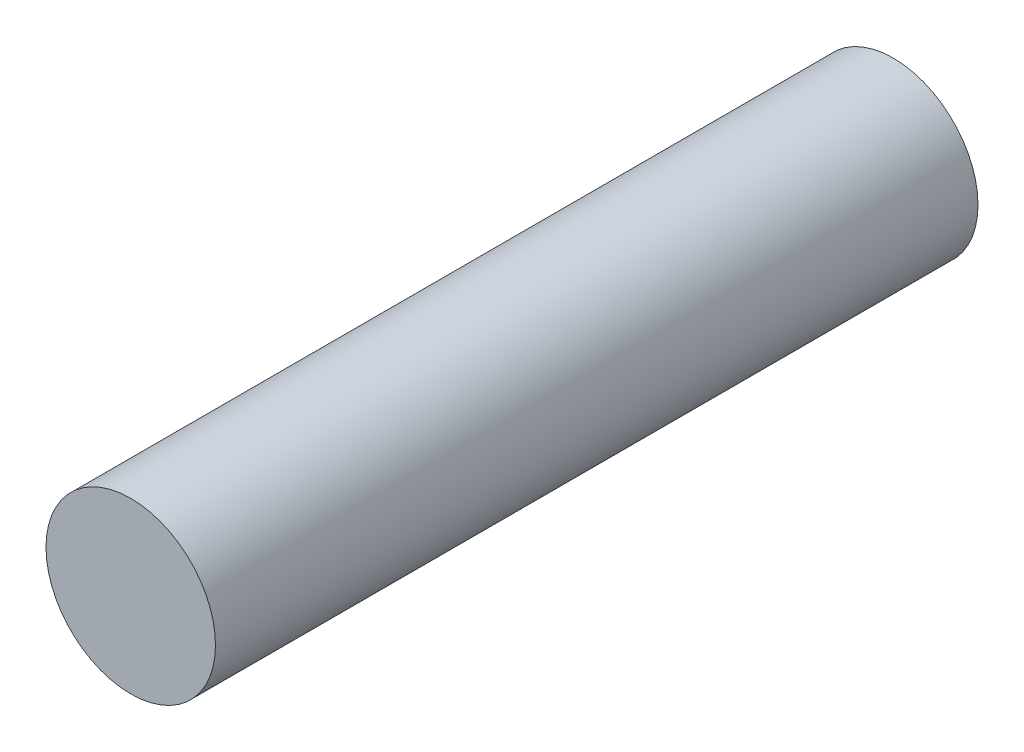
ISO-10303-21;
HEADER;
FILE_DESCRIPTION(('STEP AP214'),'2;1');
FILE_NAME('part.step','',(''),(''),'','','');
FILE_SCHEMA(('AUTOMOTIVE_DESIGN { 1 0 10303 214 1 1 1 1 }'));
ENDSEC;
DATA;
#1=APPLICATION_CONTEXT('core data for automotive mechanical design processes');
#2=APPLICATION_PROTOCOL_DEFINITION('international standard','automotive_design',2000,#1);
#3=PRODUCT_CONTEXT('',#1,'mechanical');
#4=PRODUCT('Part','Part','',(#3));
#5=PRODUCT_RELATED_PRODUCT_CATEGORY('part','',(#4));
#6=PRODUCT_DEFINITION_FORMATION('','',#4);
#7=PRODUCT_DEFINITION_CONTEXT('part definition',#1,'design');
#8=PRODUCT_DEFINITION('design','',#6,#7);
#9=PRODUCT_DEFINITION_SHAPE('','',#8);
#10=(LENGTH_UNIT() NAMED_UNIT(*) SI_UNIT(.MILLI.,.METRE.));
#11=(NAMED_UNIT(*) PLANE_ANGLE_UNIT() SI_UNIT($,.RADIAN.));
#12=(NAMED_UNIT(*) SI_UNIT($,.STERADIAN.) SOLID_ANGLE_UNIT());
#13=UNCERTAINTY_MEASURE_WITH_UNIT(LENGTH_MEASURE(1.E-05),#10,'distance_accuracy_value','');
#14=(GEOMETRIC_REPRESENTATION_CONTEXT(3) GLOBAL_UNCERTAINTY_ASSIGNED_CONTEXT((#13)) GLOBAL_UNIT_ASSIGNED_CONTEXT((#10,
#11,#12)) REPRESENTATION_CONTEXT('',''));
#15=CARTESIAN_POINT('',(0.,0.,0.));
#16=DIRECTION('',(0.,0.,1.));
#17=DIRECTION('',(1.,0.,0.));
#18=AXIS2_PLACEMENT_3D('',#15,#16,#17);
#19=CARTESIAN_POINT('',(0.,0.,0.));
#20=DIRECTION('',(0.,0.,-1.));
#21=DIRECTION('',(-1.,0.,0.));
#22=AXIS2_PLACEMENT_3D('',#19,#20,#21);
#23=PLANE('',#22);
#24=CARTESIAN_POINT('',(0.,0.,0.));
#25=DIRECTION('',(0.,0.,1.));
#26=DIRECTION('',(1.,0.,0.));
#27=AXIS2_PLACEMENT_3D('',#24,#25,#26);
#28=CIRCLE('',#27,20.);
#29=CARTESIAN_POINT('',(20.,0.,0.));
#30=VERTEX_POINT('',#29);
#31=EDGE_CURVE('E11',#30,#30,#28,.T.);
#32=ORIENTED_EDGE('',*,*,#31,.T.);
#33=EDGE_LOOP('',(#32));
#34=FACE_BOUND('',#33,.T.);
#35=ADVANCED_FACE('F40',(#34),#23,.F.);
#36=CARTESIAN_POINT('',(0.,0.,0.));
#37=DIRECTION('',(0.,0.,1.));
#38=DIRECTION('',(1.,0.,0.));
#39=AXIS2_PLACEMENT_3D('',#36,#37,#38);
#40=CYLINDRICAL_SURFACE('',#39,20.);
#41=ORIENTED_EDGE('',*,*,#31,.F.);
#42=EDGE_LOOP('',(#41));
#43=FACE_BOUND('',#42,.T.);
#44=CARTESIAN_POINT('',(0.,0.,-180.));
#45=DIRECTION('',(0.,0.,1.));
#46=DIRECTION('',(1.,0.,0.));
#47=AXIS2_PLACEMENT_3D('',#44,#45,#46);
#48=CIRCLE('',#47,20.);
#49=CARTESIAN_POINT('',(20.,0.,-180.));
#50=VERTEX_POINT('',#49);
#51=EDGE_CURVE('E47',#50,#50,#48,.T.);
#52=ORIENTED_EDGE('',*,*,#51,.T.);
#53=EDGE_LOOP('',(#52));
#54=FACE_BOUND('',#53,.T.);
#55=ADVANCED_FACE('F55',(#43,#54),#40,.T.);
#56=CARTESIAN_POINT('',(0.,20.,-180.));
#57=DIRECTION('',(0.,0.,1.));
#58=DIRECTION('',(1.,0.,0.));
#59=AXIS2_PLACEMENT_3D('',#56,#57,#58);
#60=PLANE('',#59);
#61=ORIENTED_EDGE('',*,*,#51,.F.);
#62=EDGE_LOOP('',(#61));
#63=FACE_BOUND('',#62,.T.);
#64=ADVANCED_FACE('F57',(#63),#60,.F.);
#65=CLOSED_SHELL('',(#35,#55,#64));
#66=MANIFOLD_SOLID_BREP('B2',#65);
#67=ADVANCED_BREP_SHAPE_REPRESENTATION('',(#18,#66),#14);
#68=SHAPE_DEFINITION_REPRESENTATION(#9,#67);
ENDSEC;
END-ISO-10303-21;
